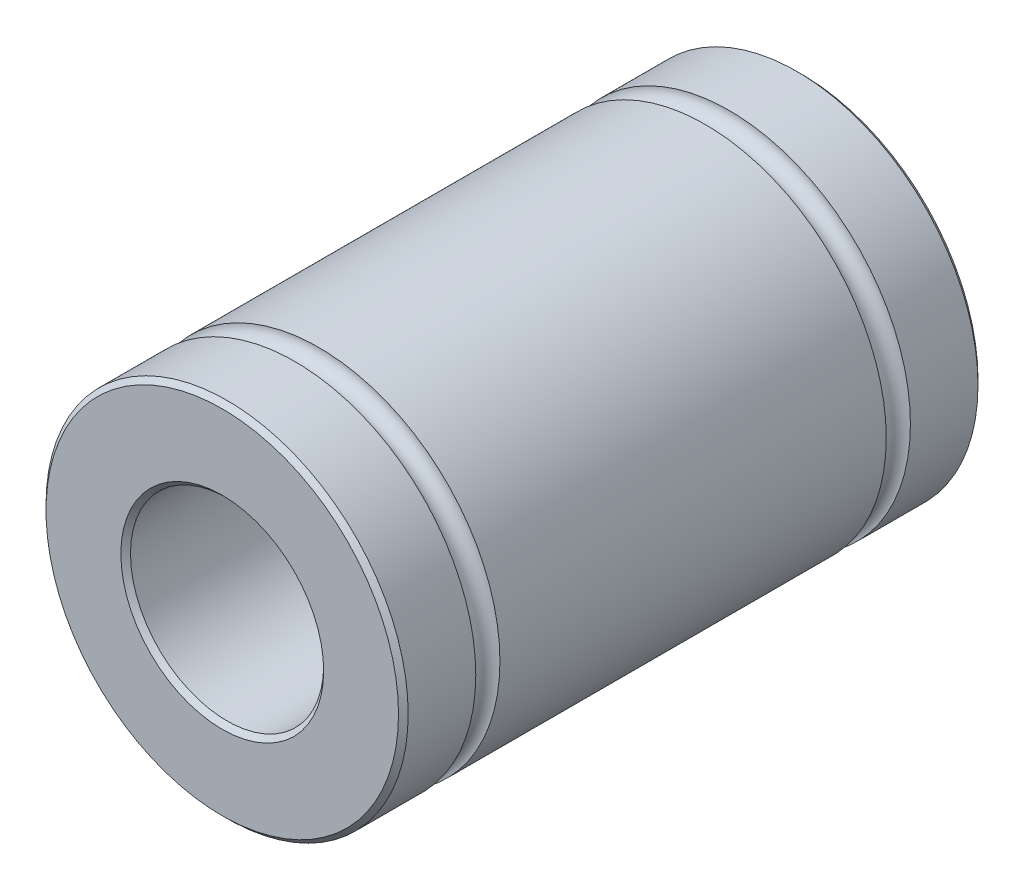
ISO-10303-21;
HEADER;
FILE_DESCRIPTION(('STEP AP214'),'2;1');
FILE_NAME('part.step','',(''),(''),'','','');
FILE_SCHEMA(('AUTOMOTIVE_DESIGN { 1 0 10303 214 1 1 1 1 }'));
ENDSEC;
DATA;
#1=APPLICATION_CONTEXT('core data for automotive mechanical design processes');
#2=APPLICATION_PROTOCOL_DEFINITION('international standard','automotive_design',2000,#1);
#3=PRODUCT_CONTEXT('',#1,'mechanical');
#4=PRODUCT('Part','Part','',(#3));
#5=PRODUCT_RELATED_PRODUCT_CATEGORY('part','',(#4));
#6=PRODUCT_DEFINITION_FORMATION('','',#4);
#7=PRODUCT_DEFINITION_CONTEXT('part definition',#1,'design');
#8=PRODUCT_DEFINITION('design','',#6,#7);
#9=PRODUCT_DEFINITION_SHAPE('','',#8);
#10=(LENGTH_UNIT() NAMED_UNIT(*) SI_UNIT(.MILLI.,.METRE.));
#11=(NAMED_UNIT(*) PLANE_ANGLE_UNIT() SI_UNIT($,.RADIAN.));
#12=(NAMED_UNIT(*) SI_UNIT($,.STERADIAN.) SOLID_ANGLE_UNIT());
#13=UNCERTAINTY_MEASURE_WITH_UNIT(LENGTH_MEASURE(1.E-05),#10,'distance_accuracy_value','');
#14=(GEOMETRIC_REPRESENTATION_CONTEXT(3) GLOBAL_UNCERTAINTY_ASSIGNED_CONTEXT((#13)) GLOBAL_UNIT_ASSIGNED_CONTEXT((#10,
#11,#12)) REPRESENTATION_CONTEXT('',''));
#15=CARTESIAN_POINT('',(0.,0.,0.));
#16=DIRECTION('',(0.,0.,1.));
#17=DIRECTION('',(1.,0.,0.));
#18=AXIS2_PLACEMENT_3D('',#15,#16,#17);
#19=CARTESIAN_POINT('',(0.,0.,12.));
#20=DIRECTION('',(0.,0.,-1.));
#21=DIRECTION('',(-1.,0.,0.));
#22=AXIS2_PLACEMENT_3D('',#19,#20,#21);
#23=CYLINDRICAL_SURFACE('',#22,7.5);
#24=CARTESIAN_POINT('',(0.,0.,-11.8));
#25=DIRECTION('',(0.,0.,1.));
#26=DIRECTION('',(1.,0.,0.));
#27=AXIS2_PLACEMENT_3D('',#24,#25,#26);
#28=CIRCLE('',#27,7.5);
#29=CARTESIAN_POINT('',(7.5,0.,-11.8));
#30=VERTEX_POINT('',#29);
#31=EDGE_CURVE('E50',#30,#30,#28,.T.);
#32=ORIENTED_EDGE('',*,*,#31,.T.);
#33=EDGE_LOOP('',(#32));
#34=FACE_BOUND('',#33,.T.);
#35=CARTESIAN_POINT('',(0.,0.,-8.99999999999999));
#36=DIRECTION('',(0.,0.,1.));
#37=DIRECTION('',(1.,0.,0.));
#38=AXIS2_PLACEMENT_3D('',#35,#36,#37);
#39=CIRCLE('',#38,7.5);
#40=CARTESIAN_POINT('',(7.5,0.,-8.99999999999999));
#41=VERTEX_POINT('',#40);
#42=EDGE_CURVE('E77',#41,#41,#39,.T.);
#43=ORIENTED_EDGE('',*,*,#42,.F.);
#44=EDGE_LOOP('',(#43));
#45=FACE_BOUND('',#44,.T.);
#46=ADVANCED_FACE('F38',(#34,#45),#23,.T.);
#47=CARTESIAN_POINT('',(0.,0.,7.99999999999999));
#48=DIRECTION('',(0.,0.,1.));
#49=DIRECTION('',(1.,0.,0.));
#50=AXIS2_PLACEMENT_3D('',#47,#48,#49);
#51=CIRCLE('',#50,7.5);
#52=CARTESIAN_POINT('',(7.5,0.,7.99999999999999));
#53=VERTEX_POINT('',#52);
#54=EDGE_CURVE('E74',#53,#53,#51,.T.);
#55=ORIENTED_EDGE('',*,*,#54,.F.);
#56=EDGE_LOOP('',(#55));
#57=FACE_BOUND('',#56,.T.);
#58=CARTESIAN_POINT('',(0.,0.,-7.99999999999999));
#59=DIRECTION('',(0.,0.,1.));
#60=DIRECTION('',(1.,0.,0.));
#61=AXIS2_PLACEMENT_3D('',#58,#59,#60);
#62=CIRCLE('',#61,7.5);
#63=CARTESIAN_POINT('',(7.5,0.,-7.99999999999999));
#64=VERTEX_POINT('',#63);
#65=EDGE_CURVE('E80',#64,#64,#62,.T.);
#66=ORIENTED_EDGE('',*,*,#65,.T.);
#67=EDGE_LOOP('',(#66));
#68=FACE_BOUND('',#67,.T.);
#69=ADVANCED_FACE('F84',(#57,#68),#23,.T.);
#70=CARTESIAN_POINT('',(0.,0.,11.8));
#71=DIRECTION('',(0.,0.,1.));
#72=DIRECTION('',(1.,0.,0.));
#73=AXIS2_PLACEMENT_3D('',#70,#71,#72);
#74=CIRCLE('',#73,7.5);
#75=CARTESIAN_POINT('',(7.5,0.,11.8));
#76=VERTEX_POINT('',#75);
#77=EDGE_CURVE('E54',#76,#76,#74,.F.);
#78=ORIENTED_EDGE('',*,*,#77,.T.);
#79=EDGE_LOOP('',(#78));
#80=FACE_BOUND('',#79,.T.);
#81=CARTESIAN_POINT('',(0.,0.,8.99999999999999));
#82=DIRECTION('',(0.,0.,1.));
#83=DIRECTION('',(1.,0.,0.));
#84=AXIS2_PLACEMENT_3D('',#81,#82,#83);
#85=CIRCLE('',#84,7.5);
#86=CARTESIAN_POINT('',(7.5,0.,8.99999999999999));
#87=VERTEX_POINT('',#86);
#88=EDGE_CURVE('E71',#87,#87,#85,.T.);
#89=ORIENTED_EDGE('',*,*,#88,.T.);
#90=EDGE_LOOP('',(#89));
#91=FACE_BOUND('',#90,.T.);
#92=ADVANCED_FACE('F96',(#80,#91),#23,.T.);
#93=CARTESIAN_POINT('',(0.,0.,12.));
#94=DIRECTION('',(0.,0.,1.));
#95=DIRECTION('',(1.,0.,0.));
#96=AXIS2_PLACEMENT_3D('',#93,#94,#95);
#97=PLANE('',#96);
#98=CARTESIAN_POINT('',(0.,0.,12.));
#99=DIRECTION('',(0.,0.,1.));
#100=DIRECTION('',(1.,0.,0.));
#101=AXIS2_PLACEMENT_3D('',#98,#99,#100);
#102=CIRCLE('',#101,4.19999999999999);
#103=CARTESIAN_POINT('',(4.19999999999999,0.,12.));
#104=VERTEX_POINT('',#103);
#105=EDGE_CURVE('E10',#104,#104,#102,.F.);
#106=ORIENTED_EDGE('',*,*,#105,.T.);
#107=EDGE_LOOP('',(#106));
#108=FACE_BOUND('',#107,.T.);
#109=CARTESIAN_POINT('',(0.,0.,12.));
#110=DIRECTION('',(0.,0.,1.));
#111=DIRECTION('',(1.,0.,0.));
#112=AXIS2_PLACEMENT_3D('',#109,#110,#111);
#113=CIRCLE('',#112,7.3);
#114=CARTESIAN_POINT('',(7.3,0.,12.));
#115=VERTEX_POINT('',#114);
#116=EDGE_CURVE('E46',#115,#115,#113,.T.);
#117=ORIENTED_EDGE('',*,*,#116,.T.);
#118=EDGE_LOOP('',(#117));
#119=FACE_BOUND('',#118,.T.);
#120=ADVANCED_FACE('F104',(#108,#119),#97,.T.);
#121=CARTESIAN_POINT('',(0.,0.,-12.));
#122=DIRECTION('',(0.,0.,1.));
#123=DIRECTION('',(1.,0.,0.));
#124=AXIS2_PLACEMENT_3D('',#121,#122,#123);
#125=PLANE('',#124);
#126=CARTESIAN_POINT('',(0.,0.,-12.));
#127=DIRECTION('',(0.,0.,1.));
#128=DIRECTION('',(1.,0.,0.));
#129=AXIS2_PLACEMENT_3D('',#126,#127,#128);
#130=CIRCLE('',#129,4.2);
#131=CARTESIAN_POINT('',(4.2,0.,-12.));
#132=VERTEX_POINT('',#131);
#133=EDGE_CURVE('E65',#132,#132,#130,.T.);
#134=ORIENTED_EDGE('',*,*,#133,.T.);
#135=EDGE_LOOP('',(#134));
#136=FACE_BOUND('',#135,.T.);
#137=CARTESIAN_POINT('',(0.,0.,-12.));
#138=DIRECTION('',(0.,0.,1.));
#139=DIRECTION('',(1.,0.,0.));
#140=AXIS2_PLACEMENT_3D('',#137,#138,#139);
#141=CIRCLE('',#140,7.3);
#142=CARTESIAN_POINT('',(7.3,0.,-12.));
#143=VERTEX_POINT('',#142);
#144=EDGE_CURVE('E68',#143,#143,#141,.F.);
#145=ORIENTED_EDGE('',*,*,#144,.T.);
#146=EDGE_LOOP('',(#145));
#147=FACE_BOUND('',#146,.T.);
#148=ADVANCED_FACE('F109',(#136,#147),#125,.F.);
#149=CARTESIAN_POINT('',(0.,0.,12.));
#150=DIRECTION('',(0.,0.,-1.));
#151=DIRECTION('',(-1.,0.,0.));
#152=AXIS2_PLACEMENT_3D('',#149,#150,#151);
#153=CYLINDRICAL_SURFACE('',#152,4.);
#154=CARTESIAN_POINT('',(0.,0.,-11.8));
#155=DIRECTION('',(0.,0.,1.));
#156=DIRECTION('',(1.,0.,0.));
#157=AXIS2_PLACEMENT_3D('',#154,#155,#156);
#158=CIRCLE('',#157,4.);
#159=CARTESIAN_POINT('',(4.,0.,-11.8));
#160=VERTEX_POINT('',#159);
#161=EDGE_CURVE('E59',#160,#160,#158,.F.);
#162=ORIENTED_EDGE('',*,*,#161,.T.);
#163=EDGE_LOOP('',(#162));
#164=FACE_BOUND('',#163,.T.);
#165=CARTESIAN_POINT('',(0.,0.,11.8));
#166=DIRECTION('',(0.,0.,1.));
#167=DIRECTION('',(1.,0.,0.));
#168=AXIS2_PLACEMENT_3D('',#165,#166,#167);
#169=CIRCLE('',#168,4.);
#170=CARTESIAN_POINT('',(4.,0.,11.8));
#171=VERTEX_POINT('',#170);
#172=EDGE_CURVE('E62',#171,#171,#169,.T.);
#173=ORIENTED_EDGE('',*,*,#172,.T.);
#174=EDGE_LOOP('',(#173));
#175=FACE_BOUND('',#174,.T.);
#176=ADVANCED_FACE('F124',(#164,#175),#153,.F.);
#177=CARTESIAN_POINT('',(0.,0.,-12.));
#178=DIRECTION('',(0.,0.,-1.));
#179=DIRECTION('',(-1.,0.,0.));
#180=AXIS2_PLACEMENT_3D('',#177,#178,#179);
#181=CONICAL_SURFACE('',#180,4.2,0.785398163397448);
#182=ORIENTED_EDGE('',*,*,#161,.F.);
#183=EDGE_LOOP('',(#182));
#184=FACE_BOUND('',#183,.T.);
#185=ORIENTED_EDGE('',*,*,#133,.F.);
#186=EDGE_LOOP('',(#185));
#187=FACE_BOUND('',#186,.T.);
#188=ADVANCED_FACE('F126',(#184,#187),#181,.F.);
#189=CARTESIAN_POINT('',(0.,0.,-11.8));
#190=DIRECTION('',(0.,0.,1.));
#191=DIRECTION('',(1.,0.,0.));
#192=AXIS2_PLACEMENT_3D('',#189,#190,#191);
#193=CONICAL_SURFACE('',#192,7.5,0.785398163397442);
#194=ORIENTED_EDGE('',*,*,#144,.F.);
#195=EDGE_LOOP('',(#194));
#196=FACE_BOUND('',#195,.T.);
#197=ORIENTED_EDGE('',*,*,#31,.F.);
#198=EDGE_LOOP('',(#197));
#199=FACE_BOUND('',#198,.T.);
#200=ADVANCED_FACE('F136',(#196,#199),#193,.T.);
#201=CARTESIAN_POINT('',(0.,0.,11.8));
#202=DIRECTION('',(0.,0.,1.));
#203=DIRECTION('',(1.,0.,0.));
#204=AXIS2_PLACEMENT_3D('',#201,#202,#203);
#205=CONICAL_SURFACE('',#204,4.,0.78539816339744);
#206=ORIENTED_EDGE('',*,*,#105,.F.);
#207=EDGE_LOOP('',(#206));
#208=FACE_BOUND('',#207,.T.);
#209=ORIENTED_EDGE('',*,*,#172,.F.);
#210=EDGE_LOOP('',(#209));
#211=FACE_BOUND('',#210,.T.);
#212=ADVANCED_FACE('F121',(#208,#211),#205,.F.);
#213=CARTESIAN_POINT('',(0.,0.,12.));
#214=DIRECTION('',(0.,0.,-1.));
#215=DIRECTION('',(-1.,0.,0.));
#216=AXIS2_PLACEMENT_3D('',#213,#214,#215);
#217=CONICAL_SURFACE('',#216,7.3,0.78539816339744);
#218=ORIENTED_EDGE('',*,*,#77,.F.);
#219=EDGE_LOOP('',(#218));
#220=FACE_BOUND('',#219,.T.);
#221=ORIENTED_EDGE('',*,*,#116,.F.);
#222=EDGE_LOOP('',(#221));
#223=FACE_BOUND('',#222,.T.);
#224=ADVANCED_FACE('F41',(#220,#223),#217,.T.);
#225=CARTESIAN_POINT('',(0.,0.,8.5));
#226=DIRECTION('',(0.,0.,1.));
#227=DIRECTION('',(1.,0.,0.));
#228=AXIS2_PLACEMENT_3D('',#225,#226,#227);
#229=TOROIDAL_SURFACE('',#228,7.5,0.5);
#230=ORIENTED_EDGE('',*,*,#54,.T.);
#231=EDGE_LOOP('',(#230));
#232=FACE_BOUND('',#231,.T.);
#233=ORIENTED_EDGE('',*,*,#88,.F.);
#234=EDGE_LOOP('',(#233));
#235=FACE_BOUND('',#234,.T.);
#236=ADVANCED_FACE('F89',(#232,#235),#229,.F.);
#237=CARTESIAN_POINT('',(0.,0.,-8.5));
#238=DIRECTION('',(0.,0.,-1.));
#239=DIRECTION('',(1.,0.,0.));
#240=AXIS2_PLACEMENT_3D('',#237,#238,#239);
#241=TOROIDAL_SURFACE('',#240,7.5,0.5);
#242=ORIENTED_EDGE('',*,*,#65,.F.);
#243=EDGE_LOOP('',(#242));
#244=FACE_BOUND('',#243,.T.);
#245=ORIENTED_EDGE('',*,*,#42,.T.);
#246=EDGE_LOOP('',(#245));
#247=FACE_BOUND('',#246,.T.);
#248=ADVANCED_FACE('F86',(#244,#247),#241,.F.);
#249=CLOSED_SHELL('',(#46,#69,#92,#120,#148,#176,#188,#200,#212,#224,#236,#248));
#250=MANIFOLD_SOLID_BREP('B2',#249);
#251=ADVANCED_BREP_SHAPE_REPRESENTATION('',(#18,#250),#14);
#252=SHAPE_DEFINITION_REPRESENTATION(#9,#251);
ENDSEC;
END-ISO-10303-21;
